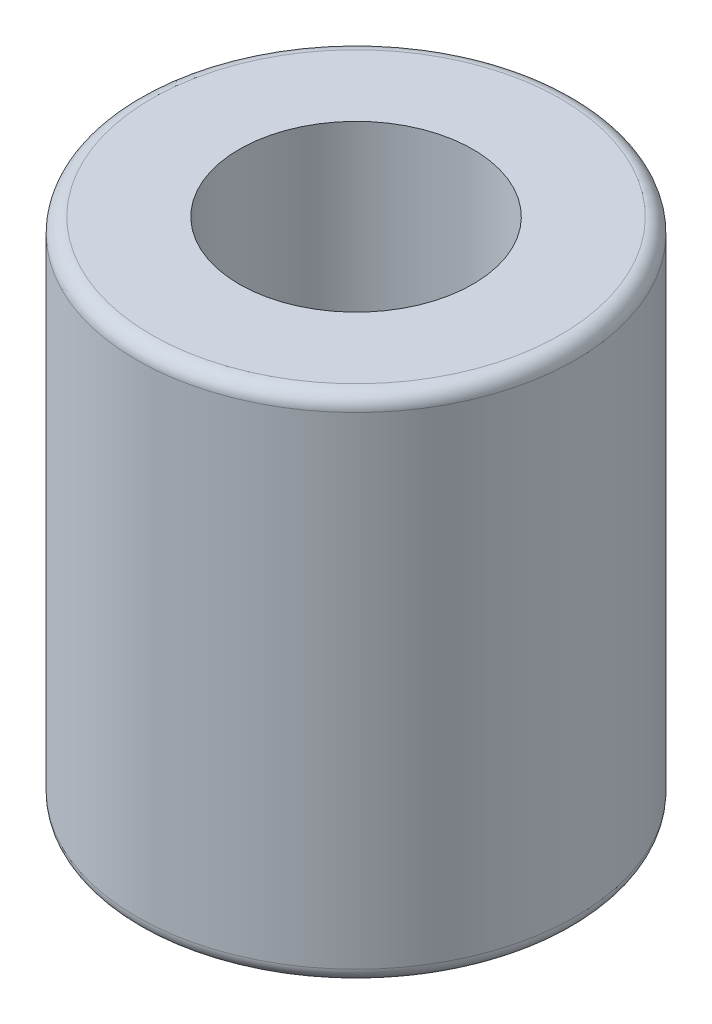
ISO-10303-21;
HEADER;
FILE_DESCRIPTION(('STEP AP214'),'2;1');
FILE_NAME('part.step','',(''),(''),'','','');
FILE_SCHEMA(('AUTOMOTIVE_DESIGN { 1 0 10303 214 1 1 1 1 }'));
ENDSEC;
DATA;
#1=APPLICATION_CONTEXT('core data for automotive mechanical design processes');
#2=APPLICATION_PROTOCOL_DEFINITION('international standard','automotive_design',2000,#1);
#3=PRODUCT_CONTEXT('',#1,'mechanical');
#4=PRODUCT('Part','Part','',(#3));
#5=PRODUCT_RELATED_PRODUCT_CATEGORY('part','',(#4));
#6=PRODUCT_DEFINITION_FORMATION('','',#4);
#7=PRODUCT_DEFINITION_CONTEXT('part definition',#1,'design');
#8=PRODUCT_DEFINITION('design','',#6,#7);
#9=PRODUCT_DEFINITION_SHAPE('','',#8);
#10=(LENGTH_UNIT() NAMED_UNIT(*) SI_UNIT(.MILLI.,.METRE.));
#11=(NAMED_UNIT(*) PLANE_ANGLE_UNIT() SI_UNIT($,.RADIAN.));
#12=(NAMED_UNIT(*) SI_UNIT($,.STERADIAN.) SOLID_ANGLE_UNIT());
#13=UNCERTAINTY_MEASURE_WITH_UNIT(LENGTH_MEASURE(1.E-05),#10,'distance_accuracy_value','');
#14=(GEOMETRIC_REPRESENTATION_CONTEXT(3) GLOBAL_UNCERTAINTY_ASSIGNED_CONTEXT((#13)) GLOBAL_UNIT_ASSIGNED_CONTEXT((#10,
#11,#12)) REPRESENTATION_CONTEXT('',''));
#15=CARTESIAN_POINT('',(0.,0.,0.));
#16=DIRECTION('',(0.,0.,1.));
#17=DIRECTION('',(1.,0.,0.));
#18=AXIS2_PLACEMENT_3D('',#15,#16,#17);
#19=CARTESIAN_POINT('',(0.,7.,0.));
#20=DIRECTION('',(0.,-1.,0.));
#21=DIRECTION('',(0.,0.,-1.));
#22=AXIS2_PLACEMENT_3D('',#19,#20,#21);
#23=CYLINDRICAL_SURFACE('',#22,3.);
#24=CARTESIAN_POINT('',(0.,0.2,0.));
#25=DIRECTION('',(0.,1.,0.));
#26=DIRECTION('',(0.,0.,1.));
#27=AXIS2_PLACEMENT_3D('',#24,#25,#26);
#28=CIRCLE('',#27,3.);
#29=CARTESIAN_POINT('',(0.,0.2,3.));
#30=VERTEX_POINT('',#29);
#31=EDGE_CURVE('E41',#30,#30,#28,.T.);
#32=ORIENTED_EDGE('',*,*,#31,.T.);
#33=EDGE_LOOP('',(#32));
#34=FACE_BOUND('',#33,.T.);
#35=CARTESIAN_POINT('',(0.,6.8,0.));
#36=DIRECTION('',(0.,1.,0.));
#37=DIRECTION('',(0.,0.,1.));
#38=AXIS2_PLACEMENT_3D('',#35,#36,#37);
#39=CIRCLE('',#38,3.);
#40=CARTESIAN_POINT('',(0.,6.8,3.));
#41=VERTEX_POINT('',#40);
#42=EDGE_CURVE('E45',#41,#41,#39,.F.);
#43=ORIENTED_EDGE('',*,*,#42,.T.);
#44=EDGE_LOOP('',(#43));
#45=FACE_BOUND('',#44,.T.);
#46=ADVANCED_FACE('F30',(#34,#45),#23,.T.);
#47=CARTESIAN_POINT('',(0.,7.,0.));
#48=DIRECTION('',(0.,1.,0.));
#49=DIRECTION('',(0.,0.,1.));
#50=AXIS2_PLACEMENT_3D('',#47,#48,#49);
#51=PLANE('',#50);
#52=CARTESIAN_POINT('',(0.,7.,0.));
#53=DIRECTION('',(0.,1.,0.));
#54=DIRECTION('',(0.,0.,1.));
#55=AXIS2_PLACEMENT_3D('',#52,#53,#54);
#56=CIRCLE('',#55,2.8);
#57=CARTESIAN_POINT('',(0.,7.,2.8));
#58=VERTEX_POINT('',#57);
#59=EDGE_CURVE('E10',#58,#58,#56,.T.);
#60=ORIENTED_EDGE('',*,*,#59,.T.);
#61=EDGE_LOOP('',(#60));
#62=FACE_BOUND('',#61,.T.);
#63=CARTESIAN_POINT('',(0.,7.,0.));
#64=DIRECTION('',(0.,1.,0.));
#65=DIRECTION('',(0.,0.,1.));
#66=AXIS2_PLACEMENT_3D('',#63,#64,#65);
#67=CIRCLE('',#66,1.6);
#68=CARTESIAN_POINT('',(0.,7.,1.6));
#69=VERTEX_POINT('',#68);
#70=EDGE_CURVE('E51',#69,#69,#67,.T.);
#71=ORIENTED_EDGE('',*,*,#70,.F.);
#72=EDGE_LOOP('',(#71));
#73=FACE_BOUND('',#72,.T.);
#74=ADVANCED_FACE('F66',(#62,#73),#51,.T.);
#75=CARTESIAN_POINT('',(0.,0.,0.));
#76=DIRECTION('',(0.,1.,0.));
#77=DIRECTION('',(0.,0.,1.));
#78=AXIS2_PLACEMENT_3D('',#75,#76,#77);
#79=PLANE('',#78);
#80=CARTESIAN_POINT('',(0.,0.,0.));
#81=DIRECTION('',(0.,1.,0.));
#82=DIRECTION('',(0.,0.,1.));
#83=AXIS2_PLACEMENT_3D('',#80,#81,#82);
#84=CIRCLE('',#83,2.8);
#85=CARTESIAN_POINT('',(0.,0.,2.8));
#86=VERTEX_POINT('',#85);
#87=EDGE_CURVE('E37',#86,#86,#84,.F.);
#88=ORIENTED_EDGE('',*,*,#87,.T.);
#89=EDGE_LOOP('',(#88));
#90=FACE_BOUND('',#89,.T.);
#91=CARTESIAN_POINT('',(0.,0.,0.));
#92=DIRECTION('',(0.,1.,0.));
#93=DIRECTION('',(0.,0.,1.));
#94=AXIS2_PLACEMENT_3D('',#91,#92,#93);
#95=CIRCLE('',#94,1.6);
#96=CARTESIAN_POINT('',(0.,0.,1.6));
#97=VERTEX_POINT('',#96);
#98=EDGE_CURVE('E50',#97,#97,#95,.T.);
#99=ORIENTED_EDGE('',*,*,#98,.T.);
#100=EDGE_LOOP('',(#99));
#101=FACE_BOUND('',#100,.T.);
#102=ADVANCED_FACE('F57',(#90,#101),#79,.F.);
#103=CARTESIAN_POINT('',(0.,0.,0.));
#104=DIRECTION('',(0.,1.,0.));
#105=DIRECTION('',(0.,0.,1.));
#106=AXIS2_PLACEMENT_3D('',#103,#104,#105);
#107=CYLINDRICAL_SURFACE('',#106,1.6);
#108=ORIENTED_EDGE('',*,*,#98,.F.);
#109=EDGE_LOOP('',(#108));
#110=FACE_BOUND('',#109,.T.);
#111=ORIENTED_EDGE('',*,*,#70,.T.);
#112=EDGE_LOOP('',(#111));
#113=FACE_BOUND('',#112,.T.);
#114=ADVANCED_FACE('F59',(#110,#113),#107,.F.);
#115=CARTESIAN_POINT('',(0.,0.2,0.));
#116=DIRECTION('',(0.,1.,0.));
#117=DIRECTION('',(0.,0.,1.));
#118=AXIS2_PLACEMENT_3D('',#115,#116,#117);
#119=TOROIDAL_SURFACE('',#118,2.8,0.2);
#120=ORIENTED_EDGE('',*,*,#87,.F.);
#121=EDGE_LOOP('',(#120));
#122=FACE_BOUND('',#121,.T.);
#123=ORIENTED_EDGE('',*,*,#31,.F.);
#124=EDGE_LOOP('',(#123));
#125=FACE_BOUND('',#124,.T.);
#126=ADVANCED_FACE('F62',(#122,#125),#119,.T.);
#127=CARTESIAN_POINT('',(0.,6.8,0.));
#128=DIRECTION('',(0.,1.,0.));
#129=DIRECTION('',(0.,0.,1.));
#130=AXIS2_PLACEMENT_3D('',#127,#128,#129);
#131=TOROIDAL_SURFACE('',#130,2.8,0.2);
#132=ORIENTED_EDGE('',*,*,#42,.F.);
#133=EDGE_LOOP('',(#132));
#134=FACE_BOUND('',#133,.T.);
#135=ORIENTED_EDGE('',*,*,#59,.F.);
#136=EDGE_LOOP('',(#135));
#137=FACE_BOUND('',#136,.T.);
#138=ADVANCED_FACE('F32',(#134,#137),#131,.T.);
#139=CLOSED_SHELL('',(#46,#74,#102,#114,#126,#138));
#140=MANIFOLD_SOLID_BREP('B2',#139);
#141=ADVANCED_BREP_SHAPE_REPRESENTATION('',(#18,#140),#14);
#142=SHAPE_DEFINITION_REPRESENTATION(#9,#141);
ENDSEC;
END-ISO-10303-21;
